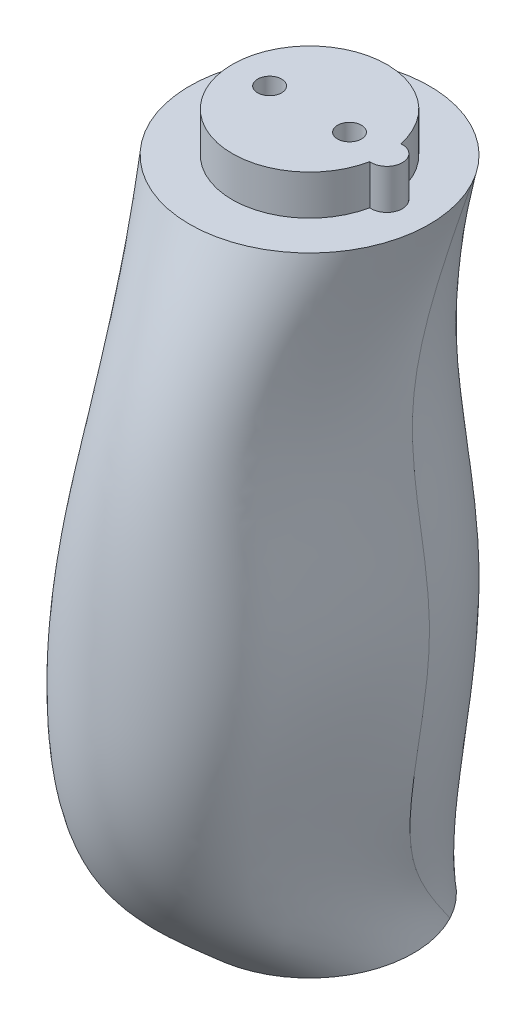
ISO-10303-21;
HEADER;
FILE_DESCRIPTION(('STEP AP214'),'2;1');
FILE_NAME('part.step','',(''),(''),'','','');
FILE_SCHEMA(('AUTOMOTIVE_DESIGN { 1 0 10303 214 1 1 1 1 }'));
ENDSEC;
DATA;
#1=APPLICATION_CONTEXT('core data for automotive mechanical design processes');
#2=APPLICATION_PROTOCOL_DEFINITION('international standard','automotive_design',2000,#1);
#3=PRODUCT_CONTEXT('',#1,'mechanical');
#4=PRODUCT('Part','Part','',(#3));
#5=PRODUCT_RELATED_PRODUCT_CATEGORY('part','',(#4));
#6=PRODUCT_DEFINITION_FORMATION('','',#4);
#7=PRODUCT_DEFINITION_CONTEXT('part definition',#1,'design');
#8=PRODUCT_DEFINITION('design','',#6,#7);
#9=PRODUCT_DEFINITION_SHAPE('','',#8);
#10=(LENGTH_UNIT() NAMED_UNIT(*) SI_UNIT(.MILLI.,.METRE.));
#11=(NAMED_UNIT(*) PLANE_ANGLE_UNIT() SI_UNIT($,.RADIAN.));
#12=(NAMED_UNIT(*) SI_UNIT($,.STERADIAN.) SOLID_ANGLE_UNIT());
#13=UNCERTAINTY_MEASURE_WITH_UNIT(LENGTH_MEASURE(1.E-05),#10,'distance_accuracy_value','');
#14=(GEOMETRIC_REPRESENTATION_CONTEXT(3) GLOBAL_UNCERTAINTY_ASSIGNED_CONTEXT((#13)) GLOBAL_UNIT_ASSIGNED_CONTEXT((#10,
#11,#12)) REPRESENTATION_CONTEXT('',''));
#15=CARTESIAN_POINT('',(0.,0.,0.));
#16=DIRECTION('',(0.,0.,1.));
#17=DIRECTION('',(1.,0.,0.));
#18=AXIS2_PLACEMENT_3D('',#15,#16,#17);
#19=CARTESIAN_POINT('',(0.,45.,0.));
#20=DIRECTION('',(0.,1.,0.));
#21=DIRECTION('',(0.,0.,1.));
#22=AXIS2_PLACEMENT_3D('',#19,#20,#21);
#23=PLANE('',#22);
#24=CARTESIAN_POINT('',(0.,45.,0.));
#25=DIRECTION('',(0.,1.,0.));
#26=DIRECTION('',(0.,0.,1.));
#27=AXIS2_PLACEMENT_3D('',#24,#25,#26);
#28=CIRCLE('',#27,9.67);
#29=CARTESIAN_POINT('',(9.47338676318511,45.,-1.94006268844828));
#30=VERTEX_POINT('',#29);
#31=CARTESIAN_POINT('',(9.47338676318511,45.,1.94006268844828));
#32=VERTEX_POINT('',#31);
#33=EDGE_CURVE('E185',#30,#32,#28,.T.);
#34=ORIENTED_EDGE('',*,*,#33,.F.);
#35=CARTESIAN_POINT('',(9.67,45.,0.));
#36=DIRECTION('',(0.,1.,0.));
#37=DIRECTION('',(0.,0.,1.));
#38=AXIS2_PLACEMENT_3D('',#35,#36,#37);
#39=CIRCLE('',#38,1.94999999999999);
#40=EDGE_CURVE('E142',#32,#30,#39,.T.);
#41=ORIENTED_EDGE('',*,*,#40,.F.);
#42=EDGE_LOOP('',(#34,#41));
#43=FACE_BOUND('',#42,.T.);
#44=CARTESIAN_POINT('',(0.,45.,0.));
#45=DIRECTION('',(0.,1.,0.));
#46=DIRECTION('',(0.,0.,1.));
#47=AXIS2_PLACEMENT_3D('',#44,#45,#46);
#48=CIRCLE('',#47,15.);
#49=CARTESIAN_POINT('',(-13.2531843312214,45.,-7.02517651612167));
#50=VERTEX_POINT('',#49);
#51=CARTESIAN_POINT('',(13.2531843312214,45.,-7.02517651612168));
#52=VERTEX_POINT('',#51);
#53=EDGE_CURVE('E12',#50,#52,#48,.T.);
#54=ORIENTED_EDGE('',*,*,#53,.T.);
#55=EDGE_CURVE('E135',#52,#50,#48,.T.);
#56=ORIENTED_EDGE('',*,*,#55,.T.);
#57=EDGE_LOOP('',(#54,#56));
#58=FACE_BOUND('',#57,.T.);
#59=ADVANCED_FACE('F125',(#43,#58),#23,.T.);
#60=CARTESIAN_POINT('',(0.,-35.,0.));
#61=DIRECTION('',(0.,1.,0.));
#62=DIRECTION('',(0.,0.,1.));
#63=AXIS2_PLACEMENT_3D('',#60,#61,#62);
#64=PLANE('',#63);
#65=CARTESIAN_POINT('',(0.,-35.,0.));
#66=DIRECTION('',(0.,1.,0.));
#67=DIRECTION('',(0.,0.,1.));
#68=AXIS2_PLACEMENT_3D('',#65,#66,#67);
#69=CIRCLE('',#68,13.);
#70=CARTESIAN_POINT('',(11.4860930870586,-35.,-6.08848631397212));
#71=VERTEX_POINT('',#70);
#72=CARTESIAN_POINT('',(-11.4860930870586,-35.,-6.08848631397211));
#73=VERTEX_POINT('',#72);
#74=EDGE_CURVE('E189',#71,#73,#69,.T.);
#75=ORIENTED_EDGE('',*,*,#74,.F.);
#76=EDGE_CURVE('E186',#73,#71,#69,.T.);
#77=ORIENTED_EDGE('',*,*,#76,.F.);
#78=EDGE_LOOP('',(#75,#77));
#79=FACE_BOUND('',#78,.T.);
#80=ADVANCED_FACE('F214',(#79),#64,.F.);
#81=CARTESIAN_POINT('',(-11.4860930870586,-35.,-6.08848631397211));
#82=CARTESIAN_POINT('',(-11.9888238762296,-31.7784022579128,-3.68120735026925));
#83=CARTESIAN_POINT('',(-13.5455110165498,-21.8028449926401,3.77284218614079));
#84=CARTESIAN_POINT('',(-16.2480426834825,0.316696116781407,-1.95027484900687));
#85=CARTESIAN_POINT('',(-12.2634498571922,23.8453925764327,2.5589909201499));
#86=CARTESIAN_POINT('',(-12.9435296898292,38.3814345691434,-4.02661275139869));
#87=CARTESIAN_POINT('',(-13.2531843312214,45.,-7.02517651612167));
#88=CARTESIAN_POINT('',(-12.0757060436891,-35.,-4.97616562275975));
#89=CARTESIAN_POINT('',(-12.2371371110871,-31.7784022579128,-2.51903239271728));
#90=CARTESIAN_POINT('',(-12.7370023910334,-21.8028449926401,5.08938902019735));
#91=CARTESIAN_POINT('',(-16.3346657911776,0.316696116781407,-0.448570482043597));
#92=CARTESIAN_POINT('',(-11.630892938393,23.8453925764327,3.75867982403654));
#93=CARTESIAN_POINT('',(-13.2130964573224,38.3814345691434,-2.76937087706511));
#94=CARTESIAN_POINT('',(-13.9335069734874,45.,-5.74172956472279));
#95=CARTESIAN_POINT('',(-12.948395240104,-35.,-2.53751404419982));
#96=CARTESIAN_POINT('',(-12.5488443580324,-31.7784022579128,-0.0663093926603867));
#97=CARTESIAN_POINT('',(-11.3116499521554,-21.8028449926401,7.58568365215385));
#98=CARTESIAN_POINT('',(-16.4287996374814,0.316696116781411,2.49746817063417));
#99=CARTESIAN_POINT('',(-10.4940715288381,23.8453925764327,6.07807317078538));
#100=CARTESIAN_POINT('',(-13.5493318211742,38.3814345691434,-0.110234345279721));
#101=CARTESIAN_POINT('',(-14.9404560462738,45.,-2.92790082023056));
#102=CARTESIAN_POINT('',(-13.1202020575421,-35.,1.38058623727581));
#103=CARTESIAN_POINT('',(-12.3291410522181,-31.7784022579128,3.76921133479779));
#104=CARTESIAN_POINT('',(-9.87965015028428,-21.80284499264,11.1654998702377));
#105=CARTESIAN_POINT('',(-16.219428466563,0.316696116781407,6.90927809821799));
#106=CARTESIAN_POINT('',(-9.26650845603646,23.8453925764326,9.45461916506622));
#107=CARTESIAN_POINT('',(-13.3014850385526,38.3814345691434,4.05262541215436));
#108=CARTESIAN_POINT('',(-15.1386946817794,45.0000000000001,1.59298411993362));
#109=CARTESIAN_POINT('',(-12.1526333497857,-35.,5.10186225458553));
#110=CARTESIAN_POINT('',(-11.4198418088333,-31.7784022579128,7.48784397983032));
#111=CARTESIAN_POINT('',(-9.15078013028185,-21.8028449926401,14.8759474115932));
#112=CARTESIAN_POINT('',(-15.6209743761056,0.316696116781415,11.4180176403135));
#113=CARTESIAN_POINT('',(-8.51785375415218,23.8453925764327,12.9042246773368));
#114=CARTESIAN_POINT('',(-12.3001227032908,38.3814345691434,8.08229161037576));
#115=CARTESIAN_POINT('',(-14.0222692497527,45.,5.88676413990638));
#116=CARTESIAN_POINT('',(-10.887357209312,-35.,7.2008252898483));
#117=CARTESIAN_POINT('',(-10.4375658061361,-31.7784022579128,9.73876470084562));
#118=CARTESIAN_POINT('',(-9.04480350028048,-21.8028449926401,17.5973994395807));
#119=CARTESIAN_POINT('',(-14.9766133635883,0.316696116781407,14.6100968458733));
#120=CARTESIAN_POINT('',(-8.28058585549539,23.8453925764327,15.3408772920504));
#121=CARTESIAN_POINT('',(-11.222719813892,38.3814345691434,10.5087937570946));
#122=CARTESIAN_POINT('',(-12.5623352415138,45.,8.30864456520958));
#123=CARTESIAN_POINT('',(-9.52001882863477,-35.,8.91024351324858));
#124=CARTESIAN_POINT('',(-9.40844097690152,-31.7784022579128,11.6846223075834));
#125=CARTESIAN_POINT('',(-9.06294432008427,-21.8028449926401,20.275382779285));
#126=CARTESIAN_POINT('',(-14.2648353782855,0.316696116781407,17.837200103447));
#127=CARTESIAN_POINT('',(-8.1443715269184,23.8453925764327,17.6694002567649));
#128=CARTESIAN_POINT('',(-10.0960135006473,38.3814345691434,12.5926165367351));
#129=CARTESIAN_POINT('',(-10.9846371099632,45.,10.2810502075945));
#130=CARTESIAN_POINT('',(-8.09358650755049,-35.,10.3149794767972));
#131=CARTESIAN_POINT('',(-8.2150129940882,-31.7784022579129,13.3458935222121));
#132=CARTESIAN_POINT('',(-8.5910055812922,-21.8028449926401,22.7310058319096));
#133=CARTESIAN_POINT('',(-13.1293598592967,0.316696116781404,20.8244046872586));
#134=CARTESIAN_POINT('',(-7.60652900077011,23.8453925764328,19.7741673405866));
#135=CARTESIAN_POINT('',(-8.79679880443047,38.3814345691434,14.3648673651839));
#136=CARTESIAN_POINT('',(-9.33875366255825,45.,11.9018993963044));
#137=CARTESIAN_POINT('',(-5.59203518305619,-35.,11.855952732266));
#138=CARTESIAN_POINT('',(-5.82898167812688,-31.7784022579129,15.2622568540078));
#139=CARTESIAN_POINT('',(-6.56267766366352,-21.8028449926399,25.8097505356229));
#140=CARTESIAN_POINT('',(-9.89329949169413,0.316696116781386,24.7478818567327));
#141=CARTESIAN_POINT('',(-5.72616000602117,23.8453925764326,22.3566075099813));
#142=CARTESIAN_POINT('',(-6.22514838959946,38.3814345691434,16.3945813004986));
#143=CARTESIAN_POINT('',(-6.45234828814175,45.,13.6799454603069));
#144=CARTESIAN_POINT('',(-2.85491084493486,-35.,12.7899670514318));
#145=CARTESIAN_POINT('',(-3.02337616970725,-31.7784022579128,16.4659575188415));
#146=CARTESIAN_POINT('',(-3.54502276528469,-21.80284499264,27.8485249123998));
#147=CARTESIAN_POINT('',(-5.3344817453263,0.316696116781405,27.4569473453695));
#148=CARTESIAN_POINT('',(-3.06633425484551,23.8453925764327,24.0401267777755));
#149=CARTESIAN_POINT('',(-3.22285892563202,38.3814345691434,17.6618278486015));
#150=CARTESIAN_POINT('',(-3.29412789800175,45.,14.7576542901136));
#151=CARTESIAN_POINT('',(0.,-35.,13.105234476939));
#152=CARTESIAN_POINT('',(0.,-31.7784022579128,16.877820595253));
#153=CARTESIAN_POINT('',(0.,-21.8028449926401,28.5594928194932));
#154=CARTESIAN_POINT('',(0.,0.316696116781421,28.4285412356542));
#155=CARTESIAN_POINT('',(0.,23.8453925764327,24.6225282855279));
#156=CARTESIAN_POINT('',(0.,38.3814345691434,18.0940003699202));
#157=CARTESIAN_POINT('',(0.,45.,15.121424396468));
#158=CARTESIAN_POINT('',(2.85491084493484,-35.,12.7899670514318));
#159=CARTESIAN_POINT('',(3.02337616970723,-31.7784022579128,16.4659575188415));
#160=CARTESIAN_POINT('',(3.54502276528469,-21.80284499264,27.8485249123997));
#161=CARTESIAN_POINT('',(5.33448174532625,0.316696116781404,27.4569473453696));
#162=CARTESIAN_POINT('',(3.0663342548455,23.8453925764327,24.0401267777754));
#163=CARTESIAN_POINT('',(3.22285892563201,38.3814345691434,17.6618278486015));
#164=CARTESIAN_POINT('',(3.29412789800174,45.,14.7576542901136));
#165=CARTESIAN_POINT('',(5.59203518305618,-35.,11.855952732266));
#166=CARTESIAN_POINT('',(5.82898167812687,-31.7784022579129,15.2622568540078));
#167=CARTESIAN_POINT('',(6.56267766366354,-21.8028449926401,25.8097505356229));
#168=CARTESIAN_POINT('',(9.89329949169404,0.316696116781398,24.7478818567327));
#169=CARTESIAN_POINT('',(5.72616000602118,23.8453925764327,22.3566075099814));
#170=CARTESIAN_POINT('',(6.22514838959946,38.3814345691434,16.3945813004986));
#171=CARTESIAN_POINT('',(6.45234828814174,44.9999999999999,13.6799454603069));
#172=CARTESIAN_POINT('',(8.09358650755047,-35.,10.3149794767972));
#173=CARTESIAN_POINT('',(8.2150129940882,-31.7784022579129,13.3458935222121));
#174=CARTESIAN_POINT('',(8.59100558129222,-21.80284499264,22.7310058319096));
#175=CARTESIAN_POINT('',(13.1293598592967,0.316696116781401,20.8244046872587));
#176=CARTESIAN_POINT('',(7.60652900077013,23.8453925764327,19.7741673405866));
#177=CARTESIAN_POINT('',(8.79679880443047,38.3814345691434,14.3648673651839));
#178=CARTESIAN_POINT('',(9.33875366255824,45.,11.9018993963044));
#179=CARTESIAN_POINT('',(9.52001882863476,-35.,8.91024351324859));
#180=CARTESIAN_POINT('',(9.40844097690152,-31.7784022579128,11.6846223075834));
#181=CARTESIAN_POINT('',(9.06294432008428,-21.8028449926401,20.275382779285));
#182=CARTESIAN_POINT('',(14.2648353782855,0.316696116781405,17.8372001034471));
#183=CARTESIAN_POINT('',(8.14437152691841,23.8453925764327,17.6694002567648));
#184=CARTESIAN_POINT('',(10.0960135006473,38.3814345691434,12.5926165367351));
#185=CARTESIAN_POINT('',(10.9846371099632,45.,10.2810502075945));
#186=CARTESIAN_POINT('',(10.887357209312,-35.,7.20082528984831));
#187=CARTESIAN_POINT('',(10.4375658061347,-31.7784022579128,9.73876470084729));
#188=CARTESIAN_POINT('',(9.04480350027502,-21.8028449926401,17.5973994395875));
#189=CARTESIAN_POINT('',(14.9766133636402,0.316696116781405,14.6100968458083));
#190=CARTESIAN_POINT('',(8.28058585531833,23.8453925764327,15.3408772922717));
#191=CARTESIAN_POINT('',(11.2227198142082,38.3814345691434,10.5087937566993));
#192=CARTESIAN_POINT('',(12.5623352420546,45.,8.30864456453352));
#193=CARTESIAN_POINT('',(12.1526333497857,-35.,5.10186225458554));
#194=CARTESIAN_POINT('',(11.4198418088344,-31.7784022579128,7.48784397982955));
#195=CARTESIAN_POINT('',(9.15078013028652,-21.8028449926401,14.87594741159));
#196=CARTESIAN_POINT('',(15.6209743760612,0.316696116781411,11.4180176403439));
#197=CARTESIAN_POINT('',(8.51785375430321,23.8453925764327,12.904224677233));
#198=CARTESIAN_POINT('',(12.3001227030211,38.3814345691434,8.08229161056118));
#199=CARTESIAN_POINT('',(14.0222692492915,45.,5.8867641402235));
#200=CARTESIAN_POINT('',(13.1202020575421,-35.,1.38058623727581));
#201=CARTESIAN_POINT('',(12.3291410522173,-31.7784022579129,3.76921133479765));
#202=CARTESIAN_POINT('',(9.8796501502809,-21.80284499264,11.1654998702371));
#203=CARTESIAN_POINT('',(16.2194284665952,0.316696116781399,6.90927809822333));
#204=CARTESIAN_POINT('',(9.26650845592629,23.8453925764327,9.45461916504786));
#205=CARTESIAN_POINT('',(13.3014850387494,38.3814345691434,4.05262541218713));
#206=CARTESIAN_POINT('',(15.138694682116,45.,1.59298411998968));
#207=CARTESIAN_POINT('',(12.948395240104,-35.,-2.53751404419982));
#208=CARTESIAN_POINT('',(12.5488443580334,-31.7784022579128,-0.0663093926592501));
#209=CARTESIAN_POINT('',(11.3116499521595,-21.8028449926401,7.5856836521585));
#210=CARTESIAN_POINT('',(16.4287996374423,0.316696116781418,2.49746817059016));
#211=CARTESIAN_POINT('',(10.4940715289713,23.8453925764327,6.07807317093477));
#212=CARTESIAN_POINT('',(13.5493318209364,38.3814345691434,-0.11023434554634));
#213=CARTESIAN_POINT('',(14.9404560458671,45.,-2.9279008206866));
#214=CARTESIAN_POINT('',(12.0757060436891,-35.,-4.97616562275976));
#215=CARTESIAN_POINT('',(12.237137111086,-31.7784022579128,-2.5190323927193));
#216=CARTESIAN_POINT('',(12.7370023910291,-21.8028449926401,5.0893890201891));
#217=CARTESIAN_POINT('',(16.3346657912193,0.316696116781405,-0.448570481965158));
#218=CARTESIAN_POINT('',(11.630892938251,23.8453925764327,3.75867982376876));
#219=CARTESIAN_POINT('',(13.2130964575759,38.3814345691434,-2.76937087658692));
#220=CARTESIAN_POINT('',(13.933506973921,45.,-5.74172956390495));
#221=CARTESIAN_POINT('',(11.4860930870586,-35.,-6.08848631397212));
#222=CARTESIAN_POINT('',(11.9888238762296,-31.7784022579128,-3.68120735026925));
#223=CARTESIAN_POINT('',(13.5455110165498,-21.8028449926401,3.77284218614081));
#224=CARTESIAN_POINT('',(16.2480426834825,0.316696116781407,-1.95027484900705));
#225=CARTESIAN_POINT('',(12.2634498571922,23.8453925764327,2.55899092014994));
#226=CARTESIAN_POINT('',(12.9435296898292,38.3814345691434,-4.02661275139869));
#227=CARTESIAN_POINT('',(13.2531843312214,45.,-7.02517651612168));
#228=B_SPLINE_SURFACE_WITH_KNOTS('',3,3,((#81,#82,#83,#84,#85,#86,#87),(#88,#89,#90,#91,#92,#93,
#94),(#95,#96,#97,#98,#99,#100,#101),(#102,#103,#104,#105,#106,#107,#108),(#109,#110,#111,#112,
#113,#114,#115),(#116,#117,#118,#119,#120,#121,#122),(#123,#124,#125,#126,#127,#128,#129),(#130,
#131,#132,#133,#134,#135,#136),(#137,#138,#139,#140,#141,#142,#143),(#144,#145,#146,#147,#148,
#149,#150),(#151,#152,#153,#154,#155,#156,#157),(#158,#159,#160,#161,#162,#163,#164),(#165,#166,
#167,#168,#169,#170,#171),(#172,#173,#174,#175,#176,#177,#178),(#179,#180,#181,#182,#183,#184,
#185),(#186,#187,#188,#189,#190,#191,#192),(#193,#194,#195,#196,#197,#198,#199),(#200,#201,#202,
#203,#204,#205,#206),(#207,#208,#209,#210,#211,#212,#213),(#214,#215,#216,#217,#218,#219,#220),
(#221,#222,#223,#224,#225,#226,#227)),.UNSPECIFIED.,.F.,.F.,.F.,(4,1,1,1,2,1,1,1,1,1,1,1,2,1,1,
1,4),(4,1,1,1,4),(0.,0.0672377758350363,0.134475551670073,0.201713327505109,0.268951103340145,
0.326713327505109,0.384475551670073,0.442237775835036,0.5,0.557762224164963,0.615524448329927,
0.673286672494891,0.731048896659854,0.798286672494891,0.865524448329927,0.932762224164964,1.),
(0.,0.143979143268855,0.445826047715341,0.747672952161826,1.),.UNSPECIFIED.);
#229=CARTESIAN_POINT('',(11.4860930870586,-35.,-6.08848631397212));
#230=CARTESIAN_POINT('',(11.9888238762296,-31.7784022579128,-3.68120735026925));
#231=CARTESIAN_POINT('',(13.5455110165498,-21.8028449926401,3.77284218614081));
#232=CARTESIAN_POINT('',(16.2480426834825,0.316696116781407,-1.95027484900705));
#233=CARTESIAN_POINT('',(12.2634498571922,23.8453925764327,2.55899092014994));
#234=CARTESIAN_POINT('',(12.9435296898292,38.3814345691434,-4.02661275139869));
#235=CARTESIAN_POINT('',(13.2531843312214,45.,-7.02517651612168));
#236=B_SPLINE_CURVE_WITH_KNOTS('',3,(#229,#230,#231,#232,#233,#234,#235),.UNSPECIFIED.,.F.,.F.,
(4,1,1,1,4),(0.,0.143979143268855,0.445826047715341,0.747672952161826,1.),.UNSPECIFIED.);
#237=EDGE_CURVE('E265',#71,#52,#236,.T.);
#238=CARTESIAN_POINT('',(-11.4860930870586,-35.,-6.08848631397211));
#239=CARTESIAN_POINT('',(-11.9888238762296,-31.7784022579128,-3.68120735026925));
#240=CARTESIAN_POINT('',(-13.5455110165498,-21.8028449926401,3.77284218614079));
#241=CARTESIAN_POINT('',(-16.2480426834825,0.316696116781407,-1.95027484900687));
#242=CARTESIAN_POINT('',(-12.2634498571922,23.8453925764327,2.5589909201499));
#243=CARTESIAN_POINT('',(-12.9435296898292,38.3814345691434,-4.02661275139869));
#244=CARTESIAN_POINT('',(-13.2531843312214,45.,-7.02517651612167));
#245=B_SPLINE_CURVE_WITH_KNOTS('',3,(#238,#239,#240,#241,#242,#243,#244),.UNSPECIFIED.,.F.,.F.,
(4,1,1,1,4),(0.,0.143979143268855,0.445826047715341,0.747672952161826,1.),.UNSPECIFIED.);
#246=EDGE_CURVE('E204',#50,#73,#245,.F.);
#247=CARTESIAN_POINT('',(-11.4860794694607,-35.0000872642447,-6.08855152055513));
#248=CARTESIAN_POINT('',(-11.48608400866,-35.0000581761632,-6.08852978502746));
#249=CARTESIAN_POINT('',(-11.4860885478593,-35.0000290880816,-6.08850804949978));
#250=CARTESIAN_POINT('',(-11.4860930870586,-35.,-6.08848631397211));
#251=CARTESIAN_POINT('',(-11.9888238762296,-31.7784022579128,-3.68120735026925));
#252=CARTESIAN_POINT('',(-13.5455110165498,-21.8028449926401,3.77284218614079));
#253=CARTESIAN_POINT('',(-16.2480426834825,0.316696116781407,-1.95027484900687));
#254=CARTESIAN_POINT('',(-12.2634498571922,23.8453925764327,2.5589909201499));
#255=CARTESIAN_POINT('',(-12.9435296898292,38.3814345691434,-4.02661275139869));
#256=CARTESIAN_POINT('',(-13.2531843312214,45.,-7.02517651612167));
#257=CARTESIAN_POINT('',(-12.0757016709644,-35.0000872642447,-4.97623217975807));
#258=CARTESIAN_POINT('',(-12.0757031285393,-35.0000581761632,-4.97620999409197));
#259=CARTESIAN_POINT('',(-12.0757045861142,-35.0000290880816,-4.97618780842586));
#260=CARTESIAN_POINT('',(-12.0757060436891,-35.,-4.97616562275975));
#261=CARTESIAN_POINT('',(-12.2371371110871,-31.7784022579128,-2.51903239271728));
#262=CARTESIAN_POINT('',(-12.7370023910334,-21.8028449926401,5.08938902019735));
#263=CARTESIAN_POINT('',(-16.3346657911776,0.316696116781407,-0.448570482043597));
#264=CARTESIAN_POINT('',(-11.630892938393,23.8453925764327,3.75867982403654));
#265=CARTESIAN_POINT('',(-13.2130964573224,38.3814345691434,-2.76937087706511));
#266=CARTESIAN_POINT('',(-13.9335069734874,45.,-5.74172956472279));
#267=CARTESIAN_POINT('',(-12.9484060628413,-35.0000872642447,-2.53758098235435));
#268=CARTESIAN_POINT('',(-12.9484024552622,-35.0000581761631,-2.53755866963618));
#269=CARTESIAN_POINT('',(-12.9483988476831,-35.0000290880816,-2.537536356918));
#270=CARTESIAN_POINT('',(-12.948395240104,-35.,-2.53751404419982));
#271=CARTESIAN_POINT('',(-12.5488443580324,-31.7784022579128,-0.0663093926603867));
#272=CARTESIAN_POINT('',(-11.3116499521554,-21.8028449926401,7.58568365215385));
#273=CARTESIAN_POINT('',(-16.4287996374814,0.316696116781411,2.49746817063417));
#274=CARTESIAN_POINT('',(-10.4940715288381,23.8453925764327,6.07807317078538));
#275=CARTESIAN_POINT('',(-13.5493318211742,38.3814345691434,-0.110234345279721));
#276=CARTESIAN_POINT('',(-14.9404560462738,45.,-2.92790082023056));
#277=CARTESIAN_POINT('',(-13.1202234852145,-35.0000872642447,1.38052153597485));
#278=CARTESIAN_POINT('',(-13.120216342657,-35.0000581761632,1.38054310307517));
#279=CARTESIAN_POINT('',(-13.1202092000996,-35.0000290880816,1.38056467017549));
#280=CARTESIAN_POINT('',(-13.1202020575421,-35.,1.38058623727581));
#281=CARTESIAN_POINT('',(-12.3291410522181,-31.7784022579128,3.76921133479779));
#282=CARTESIAN_POINT('',(-9.87965015028428,-21.80284499264,11.1654998702377));
#283=CARTESIAN_POINT('',(-16.219428466563,0.316696116781407,6.90927809821799));
#284=CARTESIAN_POINT('',(-9.26650845603646,23.8453925764326,9.45461916506622));
#285=CARTESIAN_POINT('',(-13.3014850385526,38.3814345691434,4.05262541215436));
#286=CARTESIAN_POINT('',(-15.1386946817794,45.0000000000001,1.59298411993362));
#287=CARTESIAN_POINT('',(-12.1526531990982,-35.0000872642447,5.10179762488627));
#288=CARTESIAN_POINT('',(-12.1526465826607,-35.0000581761631,5.10181916811936));
#289=CARTESIAN_POINT('',(-12.1526399662232,-35.0000290880815,5.10184071135244));
#290=CARTESIAN_POINT('',(-12.1526333497857,-35.,5.10186225458553));
#291=CARTESIAN_POINT('',(-11.4198418088333,-31.7784022579128,7.48784397983032));
#292=CARTESIAN_POINT('',(-9.15078013028185,-21.8028449926401,14.8759474115932));
#293=CARTESIAN_POINT('',(-15.6209743761056,0.316696116781415,11.4180176403135));
#294=CARTESIAN_POINT('',(-8.51785375415218,23.8453925764327,12.9042246773368));
#295=CARTESIAN_POINT('',(-12.3001227032908,38.3814345691434,8.08229161037576));
#296=CARTESIAN_POINT('',(-14.0222692497527,45.,5.88676413990638));
#297=CARTESIAN_POINT('',(-10.8873693929271,-35.0000872642447,7.20075654403222));
#298=CARTESIAN_POINT('',(-10.8873653317221,-35.0000581761631,7.20077945930424));
#299=CARTESIAN_POINT('',(-10.887361270517,-35.0000290880816,7.20080237457627));
#300=CARTESIAN_POINT('',(-10.887357209312,-35.,7.2008252898483));
#301=CARTESIAN_POINT('',(-10.4375658061361,-31.7784022579128,9.73876470084562));
#302=CARTESIAN_POINT('',(-9.04480350028048,-21.8028449926401,17.5973994395807));
#303=CARTESIAN_POINT('',(-14.9766133635883,0.316696116781407,14.6100968458733));
#304=CARTESIAN_POINT('',(-8.28058585549539,23.8453925764327,15.3408772920504));
#305=CARTESIAN_POINT('',(-11.222719813892,38.3814345691434,10.5087937570946));
#306=CARTESIAN_POINT('',(-12.5623352415138,45.,8.30864456520958));
#307=CARTESIAN_POINT('',(-9.52002185097268,-35.0000872642447,8.91016836293825));
#308=CARTESIAN_POINT('',(-9.52002084352671,-35.0000581761632,8.91019341304169));
#309=CARTESIAN_POINT('',(-9.52001983608074,-35.0000290880816,8.91021846314514));
#310=CARTESIAN_POINT('',(-9.52001882863477,-35.,8.91024351324858));
#311=CARTESIAN_POINT('',(-9.40844097690152,-31.7784022579128,11.6846223075834));
#312=CARTESIAN_POINT('',(-9.06294432008427,-21.8028449926401,20.275382779285));
#313=CARTESIAN_POINT('',(-14.2648353782855,0.316696116781407,17.837200103447));
#314=CARTESIAN_POINT('',(-8.1443715269184,23.8453925764327,17.6694002567649));
#315=CARTESIAN_POINT('',(-10.0960135006473,38.3814345691434,12.5926165367351));
#316=CARTESIAN_POINT('',(-10.9846371099632,45.,10.2810502075945));
#317=CARTESIAN_POINT('',(-8.09358321844008,-35.0000872642447,10.3148973776507));
#318=CARTESIAN_POINT('',(-8.09358431481022,-35.0000581761632,10.3149247440328));
#319=CARTESIAN_POINT('',(-8.09358541118035,-35.0000290880816,10.314952110415));
#320=CARTESIAN_POINT('',(-8.09358650755049,-35.,10.3149794767972));
#321=CARTESIAN_POINT('',(-8.2150129940882,-31.7784022579129,13.3458935222121));
#322=CARTESIAN_POINT('',(-8.5910055812922,-21.8028449926401,22.7310058319096));
#323=CARTESIAN_POINT('',(-13.1293598592967,0.316696116781404,20.8244046872586));
#324=CARTESIAN_POINT('',(-7.60652900077011,23.8453925764328,19.7741673405866));
#325=CARTESIAN_POINT('',(-8.79679880443047,38.3814345691434,14.3648673651839));
#326=CARTESIAN_POINT('',(-9.33875366255825,45.,11.9018993963044));
#327=CARTESIAN_POINT('',(-5.59202876482568,-35.0000872642448,11.8558604648322));
#328=CARTESIAN_POINT('',(-5.59203090423585,-35.0000581761632,11.8558912206434));
#329=CARTESIAN_POINT('',(-5.59203304364602,-35.0000290880816,11.8559219764547));
#330=CARTESIAN_POINT('',(-5.59203518305619,-35.,11.855952732266));
#331=CARTESIAN_POINT('',(-5.82898167812688,-31.7784022579129,15.2622568540078));
#332=CARTESIAN_POINT('',(-6.56267766366352,-21.8028449926399,25.8097505356229));
#333=CARTESIAN_POINT('',(-9.89329949169413,0.316696116781386,24.7478818567327));
#334=CARTESIAN_POINT('',(-5.72616000602117,23.8453925764326,22.3566075099813));
#335=CARTESIAN_POINT('',(-6.22514838959946,38.3814345691434,16.3945813004986));
#336=CARTESIAN_POINT('',(-6.45234828814175,45.,13.6799454603069));
#337=CARTESIAN_POINT('',(-2.85490628167138,-35.0000872642447,12.7898674789347));
#338=CARTESIAN_POINT('',(-2.85490780275921,-35.0000581761632,12.7899006697671));
#339=CARTESIAN_POINT('',(-2.85490932384704,-35.0000290880816,12.7899338605995));
#340=CARTESIAN_POINT('',(-2.85491084493486,-35.,12.7899670514318));
#341=CARTESIAN_POINT('',(-3.02337616970725,-31.7784022579128,16.4659575188415));
#342=CARTESIAN_POINT('',(-3.54502276528469,-21.80284499264,27.8485249123998));
#343=CARTESIAN_POINT('',(-5.3344817453263,0.316696116781405,27.4569473453695));
#344=CARTESIAN_POINT('',(-3.06633425484551,23.8453925764327,24.0401267777755));
#345=CARTESIAN_POINT('',(-3.22285892563202,38.3814345691434,17.6618278486015));
#346=CARTESIAN_POINT('',(-3.29412789800175,45.,14.7576542901136));
#347=CARTESIAN_POINT('',(0.,-35.0000872642447,13.1051322879307));
#348=CARTESIAN_POINT('',(0.,-35.0000581761631,13.1051663509335));
#349=CARTESIAN_POINT('',(0.,-35.0000290880815,13.1052004139362));
#350=CARTESIAN_POINT('',(0.,-35.,13.105234476939));
#351=CARTESIAN_POINT('',(0.,-31.7784022579128,16.877820595253));
#352=CARTESIAN_POINT('',(0.,-21.8028449926401,28.5594928194932));
#353=CARTESIAN_POINT('',(0.,0.316696116781421,28.4285412356542));
#354=CARTESIAN_POINT('',(0.,23.8453925764327,24.6225282855279));
#355=CARTESIAN_POINT('',(0.,38.3814345691434,18.0940003699202));
#356=CARTESIAN_POINT('',(0.,45.,15.121424396468));
#357=CARTESIAN_POINT('',(2.85490628167136,-35.0000872642447,12.7898674789347));
#358=CARTESIAN_POINT('',(2.85490780275919,-35.0000581761631,12.7899006697671));
#359=CARTESIAN_POINT('',(2.85490932384701,-35.0000290880816,12.7899338605995));
#360=CARTESIAN_POINT('',(2.85491084493484,-35.,12.7899670514318));
#361=CARTESIAN_POINT('',(3.02337616970723,-31.7784022579128,16.4659575188415));
#362=CARTESIAN_POINT('',(3.54502276528469,-21.80284499264,27.8485249123997));
#363=CARTESIAN_POINT('',(5.33448174532625,0.316696116781404,27.4569473453696));
#364=CARTESIAN_POINT('',(3.0663342548455,23.8453925764327,24.0401267777754));
#365=CARTESIAN_POINT('',(3.22285892563201,38.3814345691434,17.6618278486015));
#366=CARTESIAN_POINT('',(3.29412789800174,45.,14.7576542901136));
#367=CARTESIAN_POINT('',(5.59202876482566,-35.0000872642447,11.8558604648322));
#368=CARTESIAN_POINT('',(5.59203090423584,-35.0000581761632,11.8558912206435));
#369=CARTESIAN_POINT('',(5.59203304364601,-35.0000290880816,11.8559219764547));
#370=CARTESIAN_POINT('',(5.59203518305618,-35.,11.855952732266));
#371=CARTESIAN_POINT('',(5.82898167812687,-31.7784022579129,15.2622568540078));
#372=CARTESIAN_POINT('',(6.56267766366354,-21.8028449926401,25.8097505356229));
#373=CARTESIAN_POINT('',(9.89329949169404,0.316696116781398,24.7478818567327));
#374=CARTESIAN_POINT('',(5.72616000602118,23.8453925764327,22.3566075099814));
#375=CARTESIAN_POINT('',(6.22514838959946,38.3814345691434,16.3945813004986));
#376=CARTESIAN_POINT('',(6.45234828814174,44.9999999999999,13.6799454603069));
#377=CARTESIAN_POINT('',(8.09358321844008,-35.0000872642447,10.3148973776507));
#378=CARTESIAN_POINT('',(8.09358431481021,-35.0000581761632,10.3149247440328));
#379=CARTESIAN_POINT('',(8.09358541118034,-35.0000290880816,10.314952110415));
#380=CARTESIAN_POINT('',(8.09358650755047,-35.,10.3149794767972));
#381=CARTESIAN_POINT('',(8.2150129940882,-31.7784022579129,13.3458935222121));
#382=CARTESIAN_POINT('',(8.59100558129222,-21.80284499264,22.7310058319096));
#383=CARTESIAN_POINT('',(13.1293598592967,0.316696116781401,20.8244046872587));
#384=CARTESIAN_POINT('',(7.60652900077013,23.8453925764327,19.7741673405866));
#385=CARTESIAN_POINT('',(8.79679880443047,38.3814345691434,14.3648673651839));
#386=CARTESIAN_POINT('',(9.33875366255824,45.,11.9018993963044));
#387=CARTESIAN_POINT('',(9.52002185097267,-35.0000872642447,8.91016836293826));
#388=CARTESIAN_POINT('',(9.5200208435267,-35.0000581761632,8.9101934130417));
#389=CARTESIAN_POINT('',(9.52001983608073,-35.0000290880816,8.91021846314514));
#390=CARTESIAN_POINT('',(9.52001882863476,-35.,8.91024351324859));
#391=CARTESIAN_POINT('',(9.40844097690152,-31.7784022579128,11.6846223075834));
#392=CARTESIAN_POINT('',(9.06294432008428,-21.8028449926401,20.275382779285));
#393=CARTESIAN_POINT('',(14.2648353782855,0.316696116781405,17.8372001034471));
#394=CARTESIAN_POINT('',(8.14437152691841,23.8453925764327,17.6694002567648));
#395=CARTESIAN_POINT('',(10.0960135006473,38.3814345691434,12.5926165367351));
#396=CARTESIAN_POINT('',(10.9846371099632,45.,10.2810502075945));
#397=CARTESIAN_POINT('',(10.8873693929271,-35.0000872642447,7.20075654403223));
#398=CARTESIAN_POINT('',(10.8873653317221,-35.0000581761632,7.20077945930425));
#399=CARTESIAN_POINT('',(10.887361270517,-35.0000290880816,7.20080237457628));
#400=CARTESIAN_POINT('',(10.887357209312,-35.,7.20082528984831));
#401=CARTESIAN_POINT('',(10.4375658061347,-31.7784022579128,9.73876470084729));
#402=CARTESIAN_POINT('',(9.04480350027502,-21.8028449926401,17.5973994395875));
#403=CARTESIAN_POINT('',(14.9766133636402,0.316696116781405,14.6100968458083));
#404=CARTESIAN_POINT('',(8.28058585531833,23.8453925764327,15.3408772922717));
#405=CARTESIAN_POINT('',(11.2227198142082,38.3814345691434,10.5087937566993));
#406=CARTESIAN_POINT('',(12.5623352420546,45.,8.30864456453352));
#407=CARTESIAN_POINT('',(12.1526531990982,-35.0000872642447,5.10179762488628));
#408=CARTESIAN_POINT('',(12.1526465826607,-35.0000581761631,5.10181916811937));
#409=CARTESIAN_POINT('',(12.1526399662232,-35.0000290880816,5.10184071135245));
#410=CARTESIAN_POINT('',(12.1526333497857,-35.,5.10186225458554));
#411=CARTESIAN_POINT('',(11.4198418088344,-31.7784022579128,7.48784397982955));
#412=CARTESIAN_POINT('',(9.15078013028652,-21.8028449926401,14.87594741159));
#413=CARTESIAN_POINT('',(15.6209743760612,0.316696116781411,11.4180176403439));
#414=CARTESIAN_POINT('',(8.51785375430321,23.8453925764327,12.904224677233));
#415=CARTESIAN_POINT('',(12.3001227030211,38.3814345691434,8.08229161056118));
#416=CARTESIAN_POINT('',(14.0222692492915,45.,5.8867641402235));
#417=CARTESIAN_POINT('',(13.1202234852145,-35.0000872642448,1.38052153597485));
#418=CARTESIAN_POINT('',(13.1202163426571,-35.0000581761632,1.38054310307517));
#419=CARTESIAN_POINT('',(13.1202092000996,-35.0000290880816,1.38056467017549));
#420=CARTESIAN_POINT('',(13.1202020575421,-35.,1.38058623727581));
#421=CARTESIAN_POINT('',(12.3291410522173,-31.7784022579129,3.76921133479765));
#422=CARTESIAN_POINT('',(9.8796501502809,-21.80284499264,11.1654998702371));
#423=CARTESIAN_POINT('',(16.2194284665952,0.316696116781399,6.90927809822333));
#424=CARTESIAN_POINT('',(9.26650845592629,23.8453925764327,9.45461916504786));
#425=CARTESIAN_POINT('',(13.3014850387494,38.3814345691434,4.05262541218713));
#426=CARTESIAN_POINT('',(15.138694682116,45.,1.59298411998968));
#427=CARTESIAN_POINT('',(12.9484060628413,-35.0000872642447,-2.53758098235435));
#428=CARTESIAN_POINT('',(12.9484024552622,-35.0000581761631,-2.53755866963618));
#429=CARTESIAN_POINT('',(12.9483988476831,-35.0000290880815,-2.537536356918));
#430=CARTESIAN_POINT('',(12.948395240104,-35.,-2.53751404419982));
#431=CARTESIAN_POINT('',(12.5488443580334,-31.7784022579128,-0.0663093926592501));
#432=CARTESIAN_POINT('',(11.3116499521595,-21.8028449926401,7.5856836521585));
#433=CARTESIAN_POINT('',(16.4287996374423,0.316696116781418,2.49746817059016));
#434=CARTESIAN_POINT('',(10.4940715289713,23.8453925764327,6.07807317093477));
#435=CARTESIAN_POINT('',(13.5493318209364,38.3814345691434,-0.11023434554634));
#436=CARTESIAN_POINT('',(14.9404560458671,45.,-2.9279008206866));
#437=CARTESIAN_POINT('',(12.0757016709644,-35.0000872642447,-4.97623217975808));
#438=CARTESIAN_POINT('',(12.0757031285393,-35.0000581761632,-4.97620999409197));
#439=CARTESIAN_POINT('',(12.0757045861142,-35.0000290880816,-4.97618780842587));
#440=CARTESIAN_POINT('',(12.0757060436891,-35.,-4.97616562275976));
#441=CARTESIAN_POINT('',(12.237137111086,-31.7784022579128,-2.5190323927193));
#442=CARTESIAN_POINT('',(12.7370023910291,-21.8028449926401,5.0893890201891));
#443=CARTESIAN_POINT('',(16.3346657912193,0.316696116781405,-0.448570481965158));
#444=CARTESIAN_POINT('',(11.630892938251,23.8453925764327,3.75867982376876));
#445=CARTESIAN_POINT('',(13.2130964575759,38.3814345691434,-2.76937087658692));
#446=CARTESIAN_POINT('',(13.933506973921,45.,-5.74172956390495));
#447=CARTESIAN_POINT('',(11.4860794694607,-35.0000872642447,-6.08855152055514));
#448=CARTESIAN_POINT('',(11.48608400866,-35.0000581761632,-6.08852978502746));
#449=CARTESIAN_POINT('',(11.4860885478593,-35.0000290880816,-6.08850804949979));
#450=CARTESIAN_POINT('',(11.4860930870586,-35.,-6.08848631397212));
#451=CARTESIAN_POINT('',(11.9888238762296,-31.7784022579128,-3.68120735026925));
#452=CARTESIAN_POINT('',(13.5455110165498,-21.8028449926401,3.77284218614081));
#453=CARTESIAN_POINT('',(16.2480426834825,0.316696116781407,-1.95027484900705));
#454=CARTESIAN_POINT('',(12.2634498571922,23.8453925764327,2.55899092014994));
#455=CARTESIAN_POINT('',(12.9435296898292,38.3814345691434,-4.02661275139869));
#456=CARTESIAN_POINT('',(13.2531843312214,45.,-7.02517651612168));
#457=B_SPLINE_SURFACE_WITH_KNOTS('',3,3,((#247,#248,#249,#250,#251,#252,#253,#254,#255,#256),
(#257,#258,#259,#260,#261,#262,#263,#264,#265,#266),(#267,#268,#269,#270,#271,#272,#273,#274,
#275,#276),(#277,#278,#279,#280,#281,#282,#283,#284,#285,#286),(#287,#288,#289,#290,#291,#292,
#293,#294,#295,#296),(#297,#298,#299,#300,#301,#302,#303,#304,#305,#306),(#307,#308,#309,#310,
#311,#312,#313,#314,#315,#316),(#317,#318,#319,#320,#321,#322,#323,#324,#325,#326),(#327,#328,
#329,#330,#331,#332,#333,#334,#335,#336),(#337,#338,#339,#340,#341,#342,#343,#344,#345,#346),
(#347,#348,#349,#350,#351,#352,#353,#354,#355,#356),(#357,#358,#359,#360,#361,#362,#363,#364,
#365,#366),(#367,#368,#369,#370,#371,#372,#373,#374,#375,#376),(#377,#378,#379,#380,#381,#382,
#383,#384,#385,#386),(#387,#388,#389,#390,#391,#392,#393,#394,#395,#396),(#397,#398,#399,#400,
#401,#402,#403,#404,#405,#406),(#407,#408,#409,#410,#411,#412,#413,#414,#415,#416),(#417,#418,
#419,#420,#421,#422,#423,#424,#425,#426),(#427,#428,#429,#430,#431,#432,#433,#434,#435,#436),
(#437,#438,#439,#440,#441,#442,#443,#444,#445,#446),(#447,#448,#449,#450,#451,#452,#453,#454,
#455,#456)),.UNSPECIFIED.,.F.,.F.,.F.,(4,1,1,1,2,1,1,1,1,1,1,1,2,1,1,1,4),(4,3,1,1,1,4),(0.,
0.0672377758350363,0.134475551670073,0.201713327505109,0.268951103340145,0.326713327505109,
0.384475551670073,0.442237775835036,0.5,0.557762224164963,0.615524448329927,0.673286672494891,
0.731048896659854,0.798286672494891,0.865524448329927,0.932762224164964,1.),(-1.3E-06,0.,
0.143979143268855,0.445826047715341,0.747672952161826,1.),.UNSPECIFIED.);
#458=ORIENTED_EDGE('',*,*,#76,.T.);
#459=ORIENTED_EDGE('',*,*,#237,.T.);
#460=ORIENTED_EDGE('',*,*,#53,.F.);
#461=ORIENTED_EDGE('',*,*,#246,.T.);
#462=EDGE_LOOP('',(#458,#459,#460,#461));
#463=FACE_BOUND('',#462,.T.);
#464=ADVANCED_FACE('F224',(#463),#457,.T.);
#465=CARTESIAN_POINT('',(11.4860930870586,-35.,-6.08848631397212));
#466=CARTESIAN_POINT('',(11.9888238762296,-31.7784022579128,-3.68120735026925));
#467=CARTESIAN_POINT('',(13.5455110165498,-21.8028449926401,3.77284218614081));
#468=CARTESIAN_POINT('',(16.2480426834825,0.316696116781407,-1.95027484900706));
#469=CARTESIAN_POINT('',(12.2634498571922,23.8453925764327,2.55899092014994));
#470=CARTESIAN_POINT('',(12.9435296898292,38.3814345691434,-4.02661275139869));
#471=CARTESIAN_POINT('',(13.2531843312214,45.,-7.02517651612168));
#472=CARTESIAN_POINT('',(10.9364146532345,-35.,-7.12546945448811));
#473=CARTESIAN_POINT('',(11.6564784973406,-31.7784022579128,-4.96846054999181));
#474=CARTESIAN_POINT('',(13.8861293372618,-21.8028449926401,1.71063708141077));
#475=CARTESIAN_POINT('',(16.0719687023243,0.316696116781407,-3.92769478247291));
#476=CARTESIAN_POINT('',(12.4944797139777,23.8453925764327,0.757621103240253));
#477=CARTESIAN_POINT('',(12.5800005502916,38.3814345691434,-5.41236924221755));
#478=CARTESIAN_POINT('',(12.6189399845014,45.,-8.22169552440936));
#479=CARTESIAN_POINT('',(9.55468832556484,-34.9999999999999,-9.04962837259734));
#480=CARTESIAN_POINT('',(10.5586873355068,-31.7784022579128,-7.45217562070319));
#481=CARTESIAN_POINT('',(13.6675328276396,-21.80284499264,-2.50572274829594));
#482=CARTESIAN_POINT('',(14.9754913597739,0.316696116781411,-7.83385170802657));
#483=CARTESIAN_POINT('',(12.1862240045779,23.8453925764326,-2.90737109772789));
#484=CARTESIAN_POINT('',(11.3880608399282,38.3814345691433,-8.08458471796556));
#485=CARTESIAN_POINT('',(11.0246403756518,44.9999999999999,-10.4418788914585));
#486=CARTESIAN_POINT('',(6.78507232156829,-35.0000000000001,-11.2759931235761));
#487=CARTESIAN_POINT('',(7.76204605738042,-31.7784022579129,-10.4774010280005));
#488=CARTESIAN_POINT('',(10.7872087960243,-21.8028449926401,-8.00459038595917));
#489=CARTESIAN_POINT('',(11.2925266280915,0.316696116781395,-12.7312152124538));
#490=CARTESIAN_POINT('',(9.54831564013191,23.8453925764328,-7.661000301224));
#491=CARTESIAN_POINT('',(8.36686768629794,38.3814345691434,-11.3370009435571));
#492=CARTESIAN_POINT('',(7.82892960180954,45.,-13.010761296434));
#493=CARTESIAN_POINT('',(3.52092947916657,-34.9999999999999,-12.6802725046411));
#494=CARTESIAN_POINT('',(4.10946204166082,-31.7784022579128,-12.4483611711254));
#495=CARTESIAN_POINT('',(5.93183117326927,-21.8028449926399,-11.7302563755674));
#496=CARTESIAN_POINT('',(6.06312717757158,0.316696116781408,-15.9764644516565));
#497=CARTESIAN_POINT('',(5.23119034082015,23.8453925764325,-10.872162010674));
#498=CARTESIAN_POINT('',(4.42822014438171,38.3814345691434,-13.4550434528241));
#499=CARTESIAN_POINT('',(4.06261093749991,45.,-14.6310836592013));
#500=CARTESIAN_POINT('',(0.,-35.,-13.1600101129488));
#501=CARTESIAN_POINT('',(0.,-31.7784022579129,-13.1324090760022));
#502=CARTESIAN_POINT('',(0.,-21.8028449926401,-13.0469434944231));
#503=CARTESIAN_POINT('',(0.,0.316696116781407,-17.1119547510995));
#504=CARTESIAN_POINT('',(0.,23.8453925764328,-12.0054780192575));
#505=CARTESIAN_POINT('',(0.,38.3814345691434,-14.1899782057244));
#506=CARTESIAN_POINT('',(0.,45.,-15.1846270534025));
#507=CARTESIAN_POINT('',(-3.52092947916658,-34.9999999999999,-12.6802725046411));
#508=CARTESIAN_POINT('',(-4.10946204166079,-31.7784022579128,-12.4483611711254));
#509=CARTESIAN_POINT('',(-5.93183117326913,-21.8028449926401,-11.7302563755674));
#510=CARTESIAN_POINT('',(-6.06312717757186,0.316696116781415,-15.9764644516565));
#511=CARTESIAN_POINT('',(-5.23119034082,23.8453925764327,-10.872162010674));
#512=CARTESIAN_POINT('',(-4.42822014438167,38.3814345691434,-13.4550434528241));
#513=CARTESIAN_POINT('',(-4.06261093749991,45.,-14.6310836592013));
#514=CARTESIAN_POINT('',(-6.78507232156828,-35.0000000000001,-11.2759931235761));
#515=CARTESIAN_POINT('',(-7.76204605738044,-31.7784022579129,-10.4774010280005));
#516=CARTESIAN_POINT('',(-10.7872087960244,-21.80284499264,-8.00459038595926));
#517=CARTESIAN_POINT('',(-11.2925266280916,0.316696116781399,-12.7312152124536));
#518=CARTESIAN_POINT('',(-9.54831564013197,23.8453925764327,-7.66100030122409));
#519=CARTESIAN_POINT('',(-8.36686768629798,38.3814345691434,-11.3370009435572));
#520=CARTESIAN_POINT('',(-7.82892960180957,45.,-13.010761296434));
#521=CARTESIAN_POINT('',(-9.55468832556485,-35.,-9.04962837259736));
#522=CARTESIAN_POINT('',(-10.5586873355068,-31.7784022579128,-7.4521756207032));
#523=CARTESIAN_POINT('',(-13.6675328276395,-21.8028449926401,-2.50572274829591));
#524=CARTESIAN_POINT('',(-14.9754913597741,0.316696116781407,-7.83385170802647));
#525=CARTESIAN_POINT('',(-12.1862240045778,23.8453925764327,-2.9073710977279));
#526=CARTESIAN_POINT('',(-11.3880608399282,38.3814345691434,-8.08458471796554));
#527=CARTESIAN_POINT('',(-11.0246403756517,45.,-10.4418788914584));
#528=CARTESIAN_POINT('',(-10.9364146532345,-35.,-7.1254694544881));
#529=CARTESIAN_POINT('',(-11.6564784973406,-31.7784022579128,-4.96846054999181));
#530=CARTESIAN_POINT('',(-13.8861293372618,-21.8028449926401,1.71063708141074));
#531=CARTESIAN_POINT('',(-16.0719687023243,0.316696116781407,-3.92769478247273));
#532=CARTESIAN_POINT('',(-12.4944797139777,23.8453925764327,0.757621103240208));
#533=CARTESIAN_POINT('',(-12.5800005502916,38.3814345691434,-5.41236924221756));
#534=CARTESIAN_POINT('',(-12.6189399845014,45.,-8.22169552440935));
#535=CARTESIAN_POINT('',(-11.4860930870586,-35.,-6.08848631397211));
#536=CARTESIAN_POINT('',(-11.9888238762296,-31.7784022579128,-3.68120735026926));
#537=CARTESIAN_POINT('',(-13.5455110165498,-21.8028449926401,3.77284218614078));
#538=CARTESIAN_POINT('',(-16.2480426834825,0.316696116781407,-1.95027484900687));
#539=CARTESIAN_POINT('',(-12.2634498571922,23.8453925764327,2.5589909201499));
#540=CARTESIAN_POINT('',(-12.9435296898292,38.3814345691434,-4.02661275139869));
#541=CARTESIAN_POINT('',(-13.2531843312214,45.,-7.02517651612167));
#542=B_SPLINE_SURFACE_WITH_KNOTS('',3,3,((#465,#466,#467,#468,#469,#470,#471),(#472,#473,#474,
#475,#476,#477,#478),(#479,#480,#481,#482,#483,#484,#485),(#486,#487,#488,#489,#490,#491,#492),
(#493,#494,#495,#496,#497,#498,#499),(#500,#501,#502,#503,#504,#505,#506),(#507,#508,#509,#510,
#511,#512,#513),(#514,#515,#516,#517,#518,#519,#520),(#521,#522,#523,#524,#525,#526,#527),(#528,
#529,#530,#531,#532,#533,#534),(#535,#536,#537,#538,#539,#540,#541)),.UNSPECIFIED.,.F.,.F.,.F.,
(4,1,1,1,1,1,1,1,4),(4,1,1,1,4),(0.,0.125,0.25,0.375,0.5,0.625,0.75,0.875,1.),(0.,
0.143979143268855,0.445826047715341,0.747672952161826,1.),.UNSPECIFIED.);
#543=ORIENTED_EDGE('',*,*,#74,.T.);
#544=ORIENTED_EDGE('',*,*,#246,.F.);
#545=ORIENTED_EDGE('',*,*,#55,.F.);
#546=ORIENTED_EDGE('',*,*,#237,.F.);
#547=EDGE_LOOP('',(#543,#544,#545,#546));
#548=FACE_BOUND('',#547,.T.);
#549=ADVANCED_FACE('F232',(#548),#542,.T.);
#550=CARTESIAN_POINT('',(0.,50.,0.));
#551=DIRECTION('',(0.,-1.,0.));
#552=DIRECTION('',(0.,0.,-1.));
#553=AXIS2_PLACEMENT_3D('',#550,#551,#552);
#554=CYLINDRICAL_SURFACE('',#553,9.67);
#555=ORIENTED_EDGE('',*,*,#33,.T.);
#556=DIRECTION('',(0.,-1.,0.));
#557=VECTOR('',#556,1.);
#558=CARTESIAN_POINT('',(9.47338676318511,50.,1.94006268844828));
#559=LINE('',#558,#557);
#560=CARTESIAN_POINT('',(9.47338676318511,50.,1.94006268844828));
#561=VERTEX_POINT('',#560);
#562=EDGE_CURVE('E172',#561,#32,#559,.T.);
#563=ORIENTED_EDGE('',*,*,#562,.F.);
#564=CARTESIAN_POINT('',(0.,50.,0.));
#565=DIRECTION('',(0.,1.,0.));
#566=DIRECTION('',(0.,0.,1.));
#567=AXIS2_PLACEMENT_3D('',#564,#565,#566);
#568=CIRCLE('',#567,9.67);
#569=CARTESIAN_POINT('',(9.47338676318511,50.,-1.94006268844828));
#570=VERTEX_POINT('',#569);
#571=EDGE_CURVE('E178',#570,#561,#568,.T.);
#572=ORIENTED_EDGE('',*,*,#571,.F.);
#573=DIRECTION('',(0.,-1.,0.));
#574=VECTOR('',#573,1.);
#575=CARTESIAN_POINT('',(9.47338676318511,50.,-1.94006268844828));
#576=LINE('',#575,#574);
#577=EDGE_CURVE('E175',#570,#30,#576,.T.);
#578=ORIENTED_EDGE('',*,*,#577,.T.);
#579=EDGE_LOOP('',(#555,#563,#572,#578));
#580=FACE_BOUND('',#579,.T.);
#581=ADVANCED_FACE('F184',(#580),#554,.T.);
#582=CARTESIAN_POINT('',(-5.,50.,0.));
#583=DIRECTION('',(0.,-1.,0.));
#584=DIRECTION('',(0.,0.,-1.));
#585=AXIS2_PLACEMENT_3D('',#582,#583,#584);
#586=CYLINDRICAL_SURFACE('',#585,1.5);
#587=CARTESIAN_POINT('',(-5.,50.,0.));
#588=DIRECTION('',(0.,1.,0.));
#589=DIRECTION('',(0.,0.,1.));
#590=AXIS2_PLACEMENT_3D('',#587,#588,#589);
#591=CIRCLE('',#590,1.5);
#592=CARTESIAN_POINT('',(-5.,50.,1.5));
#593=VERTEX_POINT('',#592);
#594=EDGE_CURVE('E182',#593,#593,#591,.T.);
#595=ORIENTED_EDGE('',*,*,#594,.T.);
#596=EDGE_LOOP('',(#595));
#597=FACE_BOUND('',#596,.T.);
#598=CARTESIAN_POINT('',(-5.,45.,0.));
#599=DIRECTION('',(0.,1.,0.));
#600=DIRECTION('',(0.,0.,1.));
#601=AXIS2_PLACEMENT_3D('',#598,#599,#600);
#602=CIRCLE('',#601,1.5);
#603=CARTESIAN_POINT('',(-5.,45.,1.5));
#604=VERTEX_POINT('',#603);
#605=EDGE_CURVE('E314',#604,#604,#602,.T.);
#606=ORIENTED_EDGE('',*,*,#605,.F.);
#607=EDGE_LOOP('',(#606));
#608=FACE_BOUND('',#607,.T.);
#609=ADVANCED_FACE('F297',(#597,#608),#586,.F.);
#610=CARTESIAN_POINT('',(5.,50.,0.));
#611=DIRECTION('',(0.,-1.,0.));
#612=DIRECTION('',(0.,0.,-1.));
#613=AXIS2_PLACEMENT_3D('',#610,#611,#612);
#614=CYLINDRICAL_SURFACE('',#613,1.5);
#615=CARTESIAN_POINT('',(5.,50.,0.));
#616=DIRECTION('',(0.,1.,0.));
#617=DIRECTION('',(0.,0.,1.));
#618=AXIS2_PLACEMENT_3D('',#615,#616,#617);
#619=CIRCLE('',#618,1.5);
#620=CARTESIAN_POINT('',(5.,50.,1.5));
#621=VERTEX_POINT('',#620);
#622=EDGE_CURVE('E321',#621,#621,#619,.T.);
#623=ORIENTED_EDGE('',*,*,#622,.T.);
#624=EDGE_LOOP('',(#623));
#625=FACE_BOUND('',#624,.T.);
#626=CARTESIAN_POINT('',(5.,45.,0.));
#627=DIRECTION('',(0.,1.,0.));
#628=DIRECTION('',(0.,0.,1.));
#629=AXIS2_PLACEMENT_3D('',#626,#627,#628);
#630=CIRCLE('',#629,1.5);
#631=CARTESIAN_POINT('',(5.,45.,1.5));
#632=VERTEX_POINT('',#631);
#633=EDGE_CURVE('E316',#632,#632,#630,.T.);
#634=ORIENTED_EDGE('',*,*,#633,.F.);
#635=EDGE_LOOP('',(#634));
#636=FACE_BOUND('',#635,.T.);
#637=ADVANCED_FACE('F225',(#625,#636),#614,.F.);
#638=CARTESIAN_POINT('',(9.67,50.,0.));
#639=DIRECTION('',(0.,-1.,0.));
#640=DIRECTION('',(0.,0.,-1.));
#641=AXIS2_PLACEMENT_3D('',#638,#639,#640);
#642=CYLINDRICAL_SURFACE('',#641,1.94999999999999);
#643=ORIENTED_EDGE('',*,*,#40,.T.);
#644=ORIENTED_EDGE('',*,*,#577,.F.);
#645=CARTESIAN_POINT('',(9.67,50.,0.));
#646=DIRECTION('',(0.,1.,0.));
#647=DIRECTION('',(0.,0.,1.));
#648=AXIS2_PLACEMENT_3D('',#645,#646,#647);
#649=CIRCLE('',#648,1.94999999999999);
#650=EDGE_CURVE('E168',#561,#570,#649,.T.);
#651=ORIENTED_EDGE('',*,*,#650,.F.);
#652=ORIENTED_EDGE('',*,*,#562,.T.);
#653=EDGE_LOOP('',(#643,#644,#651,#652));
#654=FACE_BOUND('',#653,.T.);
#655=ADVANCED_FACE('F170',(#654),#642,.T.);
#656=CARTESIAN_POINT('',(0.,50.,0.));
#657=DIRECTION('',(0.,1.,0.));
#658=DIRECTION('',(0.,0.,1.));
#659=AXIS2_PLACEMENT_3D('',#656,#657,#658);
#660=PLANE('',#659);
#661=ORIENTED_EDGE('',*,*,#622,.F.);
#662=EDGE_LOOP('',(#661));
#663=FACE_BOUND('',#662,.T.);
#664=ORIENTED_EDGE('',*,*,#594,.F.);
#665=EDGE_LOOP('',(#664));
#666=FACE_BOUND('',#665,.T.);
#667=ORIENTED_EDGE('',*,*,#571,.T.);
#668=ORIENTED_EDGE('',*,*,#650,.T.);
#669=EDGE_LOOP('',(#667,#668));
#670=FACE_BOUND('',#669,.T.);
#671=ADVANCED_FACE('F180',(#663,#666,#670),#660,.T.);
#672=ORIENTED_EDGE('',*,*,#605,.T.);
#673=EDGE_LOOP('',(#672));
#674=FACE_BOUND('',#673,.T.);
#675=ADVANCED_FACE('F300',(#674),#23,.T.);
#676=ORIENTED_EDGE('',*,*,#633,.T.);
#677=EDGE_LOOP('',(#676));
#678=FACE_BOUND('',#677,.T.);
#679=ADVANCED_FACE('F299',(#678),#23,.T.);
#680=CLOSED_SHELL('',(#59,#80,#464,#549,#581,#609,#637,#655,#671,#675,#679));
#681=MANIFOLD_SOLID_BREP('B2',#680);
#682=ADVANCED_BREP_SHAPE_REPRESENTATION('',(#18,#681),#14);
#683=SHAPE_DEFINITION_REPRESENTATION(#9,#682);
ENDSEC;
END-ISO-10303-21;
